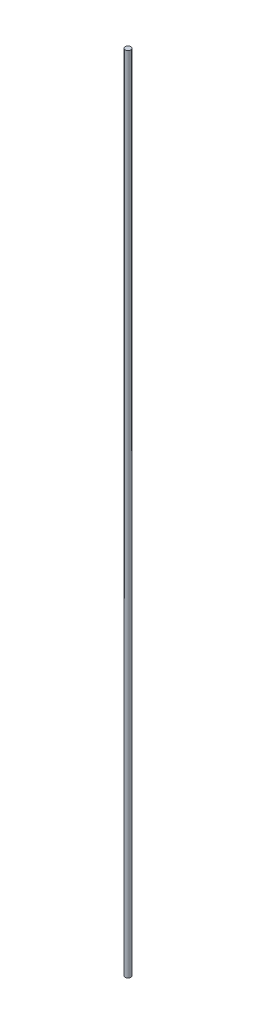
ISO-10303-21;
HEADER;
FILE_DESCRIPTION(('STEP AP214'),'2;1');
FILE_NAME('part.step','',(''),(''),'','','');
FILE_SCHEMA(('AUTOMOTIVE_DESIGN { 1 0 10303 214 1 1 1 1 }'));
ENDSEC;
DATA;
#1=APPLICATION_CONTEXT('core data for automotive mechanical design processes');
#2=APPLICATION_PROTOCOL_DEFINITION('international standard','automotive_design',2000,#1);
#3=PRODUCT_CONTEXT('',#1,'mechanical');
#4=PRODUCT('Part','Part','',(#3));
#5=PRODUCT_RELATED_PRODUCT_CATEGORY('part','',(#4));
#6=PRODUCT_DEFINITION_FORMATION('','',#4);
#7=PRODUCT_DEFINITION_CONTEXT('part definition',#1,'design');
#8=PRODUCT_DEFINITION('design','',#6,#7);
#9=PRODUCT_DEFINITION_SHAPE('','',#8);
#10=(LENGTH_UNIT() NAMED_UNIT(*) SI_UNIT(.MILLI.,.METRE.));
#11=(NAMED_UNIT(*) PLANE_ANGLE_UNIT() SI_UNIT($,.RADIAN.));
#12=(NAMED_UNIT(*) SI_UNIT($,.STERADIAN.) SOLID_ANGLE_UNIT());
#13=UNCERTAINTY_MEASURE_WITH_UNIT(LENGTH_MEASURE(1.E-05),#10,'distance_accuracy_value','');
#14=(GEOMETRIC_REPRESENTATION_CONTEXT(3) GLOBAL_UNCERTAINTY_ASSIGNED_CONTEXT((#13)) GLOBAL_UNIT_ASSIGNED_CONTEXT((#10,
#11,#12)) REPRESENTATION_CONTEXT('',''));
#15=CARTESIAN_POINT('',(0.,0.,0.));
#16=DIRECTION('',(0.,0.,1.));
#17=DIRECTION('',(1.,0.,0.));
#18=AXIS2_PLACEMENT_3D('',#15,#16,#17);
#19=CARTESIAN_POINT('',(0.,500.,0.));
#20=DIRECTION('',(0.,-1.,0.));
#21=DIRECTION('',(0.,0.,-1.));
#22=AXIS2_PLACEMENT_3D('',#19,#20,#21);
#23=CYLINDRICAL_SURFACE('',#22,1.75);
#24=CARTESIAN_POINT('',(0.,500.,0.));
#25=DIRECTION('',(0.,1.,0.));
#26=DIRECTION('',(0.,0.,1.));
#27=AXIS2_PLACEMENT_3D('',#24,#25,#26);
#28=CIRCLE('',#27,1.75);
#29=CARTESIAN_POINT('',(0.,500.,1.75));
#30=VERTEX_POINT('',#29);
#31=EDGE_CURVE('E10',#30,#30,#28,.T.);
#32=ORIENTED_EDGE('',*,*,#31,.F.);
#33=EDGE_LOOP('',(#32));
#34=FACE_BOUND('',#33,.T.);
#35=CARTESIAN_POINT('',(0.,0.,0.));
#36=DIRECTION('',(0.,1.,0.));
#37=DIRECTION('',(0.,0.,1.));
#38=AXIS2_PLACEMENT_3D('',#35,#36,#37);
#39=CIRCLE('',#38,1.75);
#40=CARTESIAN_POINT('',(0.,0.,1.75));
#41=VERTEX_POINT('',#40);
#42=EDGE_CURVE('E40',#41,#41,#39,.T.);
#43=ORIENTED_EDGE('',*,*,#42,.T.);
#44=EDGE_LOOP('',(#43));
#45=FACE_BOUND('',#44,.T.);
#46=ADVANCED_FACE('F37',(#34,#45),#23,.T.);
#47=CARTESIAN_POINT('',(0.,500.,0.));
#48=DIRECTION('',(0.,1.,0.));
#49=DIRECTION('',(0.,0.,1.));
#50=AXIS2_PLACEMENT_3D('',#47,#48,#49);
#51=PLANE('',#50);
#52=ORIENTED_EDGE('',*,*,#31,.T.);
#53=EDGE_LOOP('',(#52));
#54=FACE_BOUND('',#53,.T.);
#55=ADVANCED_FACE('F52',(#54),#51,.T.);
#56=CARTESIAN_POINT('',(0.,0.,0.));
#57=DIRECTION('',(0.,1.,0.));
#58=DIRECTION('',(0.,0.,1.));
#59=AXIS2_PLACEMENT_3D('',#56,#57,#58);
#60=PLANE('',#59);
#61=ORIENTED_EDGE('',*,*,#42,.F.);
#62=EDGE_LOOP('',(#61));
#63=FACE_BOUND('',#62,.T.);
#64=ADVANCED_FACE('F50',(#63),#60,.F.);
#65=CLOSED_SHELL('',(#46,#55,#64));
#66=MANIFOLD_SOLID_BREP('B2',#65);
#67=ADVANCED_BREP_SHAPE_REPRESENTATION('',(#18,#66),#14);
#68=SHAPE_DEFINITION_REPRESENTATION(#9,#67);
ENDSEC;
END-ISO-10303-21;
